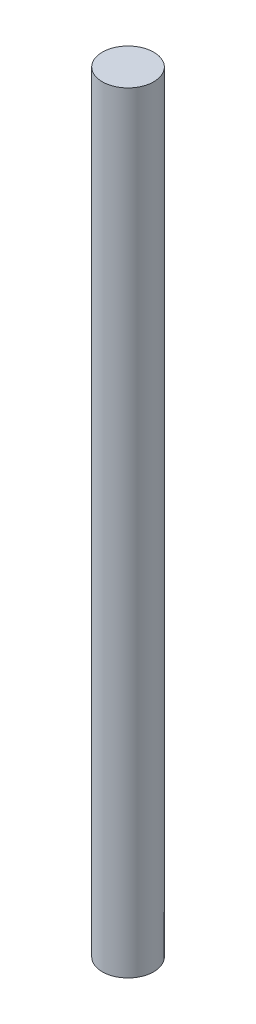
ISO-10303-21;
HEADER;
FILE_DESCRIPTION(('STEP AP214'),'2;1');
FILE_NAME('part.step','',(''),(''),'','','');
FILE_SCHEMA(('AUTOMOTIVE_DESIGN { 1 0 10303 214 1 1 1 1 }'));
ENDSEC;
DATA;
#1=APPLICATION_CONTEXT('core data for automotive mechanical design processes');
#2=APPLICATION_PROTOCOL_DEFINITION('international standard','automotive_design',2000,#1);
#3=PRODUCT_CONTEXT('',#1,'mechanical');
#4=PRODUCT('Part','Part','',(#3));
#5=PRODUCT_RELATED_PRODUCT_CATEGORY('part','',(#4));
#6=PRODUCT_DEFINITION_FORMATION('','',#4);
#7=PRODUCT_DEFINITION_CONTEXT('part definition',#1,'design');
#8=PRODUCT_DEFINITION('design','',#6,#7);
#9=PRODUCT_DEFINITION_SHAPE('','',#8);
#10=(LENGTH_UNIT() NAMED_UNIT(*) SI_UNIT(.MILLI.,.METRE.));
#11=(NAMED_UNIT(*) PLANE_ANGLE_UNIT() SI_UNIT($,.RADIAN.));
#12=(NAMED_UNIT(*) SI_UNIT($,.STERADIAN.) SOLID_ANGLE_UNIT());
#13=UNCERTAINTY_MEASURE_WITH_UNIT(LENGTH_MEASURE(1.E-05),#10,'distance_accuracy_value','');
#14=(GEOMETRIC_REPRESENTATION_CONTEXT(3) GLOBAL_UNCERTAINTY_ASSIGNED_CONTEXT((#13)) GLOBAL_UNIT_ASSIGNED_CONTEXT((#10,
#11,#12)) REPRESENTATION_CONTEXT('',''));
#15=CARTESIAN_POINT('',(0.,0.,0.));
#16=DIRECTION('',(0.,0.,1.));
#17=DIRECTION('',(1.,0.,0.));
#18=AXIS2_PLACEMENT_3D('',#15,#16,#17);
#19=CARTESIAN_POINT('',(0.,45.,0.));
#20=DIRECTION('',(0.,-1.,0.));
#21=DIRECTION('',(0.,0.,-1.));
#22=AXIS2_PLACEMENT_3D('',#19,#20,#21);
#23=CYLINDRICAL_SURFACE('',#22,1.5);
#24=CARTESIAN_POINT('',(0.,45.,0.));
#25=DIRECTION('',(0.,1.,0.));
#26=DIRECTION('',(0.,0.,1.));
#27=AXIS2_PLACEMENT_3D('',#24,#25,#26);
#28=CIRCLE('',#27,1.5);
#29=CARTESIAN_POINT('',(0.,45.,-1.5));
#30=VERTEX_POINT('',#29);
#31=EDGE_CURVE('E10',#30,#30,#28,.T.);
#32=CARTESIAN_POINT('',(0.,0.,0.));
#33=DIRECTION('',(0.,1.,0.));
#34=DIRECTION('',(0.,0.,1.));
#35=AXIS2_PLACEMENT_3D('',#32,#33,#34);
#36=CIRCLE('',#35,1.5);
#37=CARTESIAN_POINT('',(0.,0.,-1.5));
#38=VERTEX_POINT('',#37);
#39=EDGE_CURVE('E34',#38,#38,#36,.T.);
#40=CARTESIAN_POINT('',(0.,45.,-1.5));
#41=CARTESIAN_POINT('',(0.,44.53125,-1.5));
#42=CARTESIAN_POINT('',(0.,44.0625,-1.5));
#43=CARTESIAN_POINT('',(0.,43.125,-1.5));
#44=CARTESIAN_POINT('',(0.,42.65625,-1.5));
#45=CARTESIAN_POINT('',(0.,41.71875,-1.5));
#46=CARTESIAN_POINT('',(0.,41.25,-1.5));
#47=CARTESIAN_POINT('',(0.,40.3125,-1.5));
#48=CARTESIAN_POINT('',(0.,39.84375,-1.5));
#49=CARTESIAN_POINT('',(0.,38.90625,-1.5));
#50=CARTESIAN_POINT('',(0.,38.4375,-1.5));
#51=CARTESIAN_POINT('',(0.,37.5,-1.5));
#52=CARTESIAN_POINT('',(0.,37.03125,-1.5));
#53=CARTESIAN_POINT('',(0.,36.09375,-1.5));
#54=CARTESIAN_POINT('',(0.,35.625,-1.5));
#55=CARTESIAN_POINT('',(0.,34.6875,-1.5));
#56=CARTESIAN_POINT('',(0.,34.21875,-1.5));
#57=CARTESIAN_POINT('',(0.,33.28125,-1.5));
#58=CARTESIAN_POINT('',(0.,32.8125,-1.5));
#59=CARTESIAN_POINT('',(0.,31.875,-1.5));
#60=CARTESIAN_POINT('',(0.,31.40625,-1.5));
#61=CARTESIAN_POINT('',(0.,30.46875,-1.5));
#62=CARTESIAN_POINT('',(0.,30.,-1.5));
#63=CARTESIAN_POINT('',(0.,29.0625,-1.5));
#64=CARTESIAN_POINT('',(0.,28.59375,-1.5));
#65=CARTESIAN_POINT('',(0.,27.65625,-1.5));
#66=CARTESIAN_POINT('',(0.,27.1875,-1.5));
#67=CARTESIAN_POINT('',(0.,26.25,-1.5));
#68=CARTESIAN_POINT('',(0.,25.78125,-1.5));
#69=CARTESIAN_POINT('',(0.,24.84375,-1.5));
#70=CARTESIAN_POINT('',(0.,24.375,-1.5));
#71=CARTESIAN_POINT('',(0.,23.4375,-1.5));
#72=CARTESIAN_POINT('',(0.,22.96875,-1.5));
#73=CARTESIAN_POINT('',(0.,22.03125,-1.5));
#74=CARTESIAN_POINT('',(0.,21.5625,-1.5));
#75=CARTESIAN_POINT('',(0.,20.625,-1.5));
#76=CARTESIAN_POINT('',(0.,20.15625,-1.5));
#77=CARTESIAN_POINT('',(0.,19.21875,-1.5));
#78=CARTESIAN_POINT('',(0.,18.75,-1.5));
#79=CARTESIAN_POINT('',(0.,17.8125,-1.5));
#80=CARTESIAN_POINT('',(0.,17.34375,-1.5));
#81=CARTESIAN_POINT('',(0.,16.40625,-1.5));
#82=CARTESIAN_POINT('',(0.,15.9375,-1.5));
#83=CARTESIAN_POINT('',(0.,15.,-1.5));
#84=CARTESIAN_POINT('',(0.,14.53125,-1.5));
#85=CARTESIAN_POINT('',(0.,13.59375,-1.5));
#86=CARTESIAN_POINT('',(0.,13.125,-1.5));
#87=CARTESIAN_POINT('',(0.,12.1875,-1.5));
#88=CARTESIAN_POINT('',(0.,11.71875,-1.5));
#89=CARTESIAN_POINT('',(0.,10.78125,-1.5));
#90=CARTESIAN_POINT('',(0.,10.3125,-1.5));
#91=CARTESIAN_POINT('',(0.,9.37499999999999,-1.5));
#92=CARTESIAN_POINT('',(0.,8.90624999999999,-1.5));
#93=CARTESIAN_POINT('',(0.,7.96874999999999,-1.5));
#94=CARTESIAN_POINT('',(0.,7.5,-1.5));
#95=CARTESIAN_POINT('',(0.,6.56249999999999,-1.5));
#96=CARTESIAN_POINT('',(0.,6.09374999999999,-1.5));
#97=CARTESIAN_POINT('',(0.,5.15624999999999,-1.5));
#98=CARTESIAN_POINT('',(0.,4.68749999999999,-1.5));
#99=CARTESIAN_POINT('',(0.,3.74999999999999,-1.5));
#100=CARTESIAN_POINT('',(0.,3.28124999999999,-1.5));
#101=CARTESIAN_POINT('',(0.,2.34374999999999,-1.5));
#102=CARTESIAN_POINT('',(0.,1.87499999999999,-1.5));
#103=CARTESIAN_POINT('',(0.,0.937499999999992,-1.5));
#104=CARTESIAN_POINT('',(0.,0.468749999999993,-1.5));
#105=CARTESIAN_POINT('',(0.,0.,-1.5));
#106=B_SPLINE_CURVE_WITH_KNOTS('',3,(#40,#41,#42,#43,#44,#45,#46,#47,#48,#49,#50,#51,#52,#53,
#54,#55,#56,#57,#58,#59,#60,#61,#62,#63,#64,#65,#66,#67,#68,#69,#70,#71,#72,#73,#74,#75,#76,#77,
#78,#79,#80,#81,#82,#83,#84,#85,#86,#87,#88,#89,#90,#91,#92,#93,#94,#95,#96,#97,#98,#99,#100,
#101,#102,#103,#104,#105),.UNSPECIFIED.,.F.,.F.,(4,2,2,2,2,2,2,2,2,2,2,2,2,2,2,2,2,2,2,2,2,2,2,
2,2,2,2,2,2,2,2,2,4),(0.,1.40625,2.8125,4.21874999999999,5.625,7.03125,8.43749999999999,9.84375,
11.25,12.65625,14.0625,15.46875,16.875,18.28125,19.6875,21.09375,22.5,23.90625,25.3125,26.71875,
28.125,29.53125,30.9375,32.34375,33.75,35.15625,36.5625,37.96875,39.375,40.78125,42.1875,
43.59375,45.),.UNSPECIFIED.);
#107=EDGE_CURVE('BSEAM31',#30,#38,#106,.T.);
#108=ORIENTED_EDGE('',*,*,#31,.F.);
#109=ORIENTED_EDGE('',*,*,#39,.T.);
#110=ORIENTED_EDGE('',*,*,#107,.T.);
#111=ORIENTED_EDGE('',*,*,#107,.F.);
#112=EDGE_LOOP('',(#108,#110,#109,#111));
#113=FACE_BOUND('',#112,.T.);
#114=ADVANCED_FACE('F31',(#113),#23,.T.);
#115=CARTESIAN_POINT('',(0.,45.,0.));
#116=DIRECTION('',(0.,1.,0.));
#117=DIRECTION('',(0.,0.,1.));
#118=AXIS2_PLACEMENT_3D('',#115,#116,#117);
#119=PLANE('',#118);
#120=ORIENTED_EDGE('',*,*,#31,.T.);
#121=EDGE_LOOP('',(#120));
#122=FACE_BOUND('',#121,.T.);
#123=ADVANCED_FACE('F46',(#122),#119,.T.);
#124=CARTESIAN_POINT('',(0.,0.,0.));
#125=DIRECTION('',(0.,1.,0.));
#126=DIRECTION('',(0.,0.,1.));
#127=AXIS2_PLACEMENT_3D('',#124,#125,#126);
#128=PLANE('',#127);
#129=ORIENTED_EDGE('',*,*,#39,.F.);
#130=EDGE_LOOP('',(#129));
#131=FACE_BOUND('',#130,.T.);
#132=ADVANCED_FACE('F44',(#131),#128,.F.);
#133=CLOSED_SHELL('',(#114,#123,#132));
#134=MANIFOLD_SOLID_BREP('B2',#133);
#135=ADVANCED_BREP_SHAPE_REPRESENTATION('',(#18,#134),#14);
#136=SHAPE_DEFINITION_REPRESENTATION(#9,#135);
ENDSEC;
END-ISO-10303-21;
